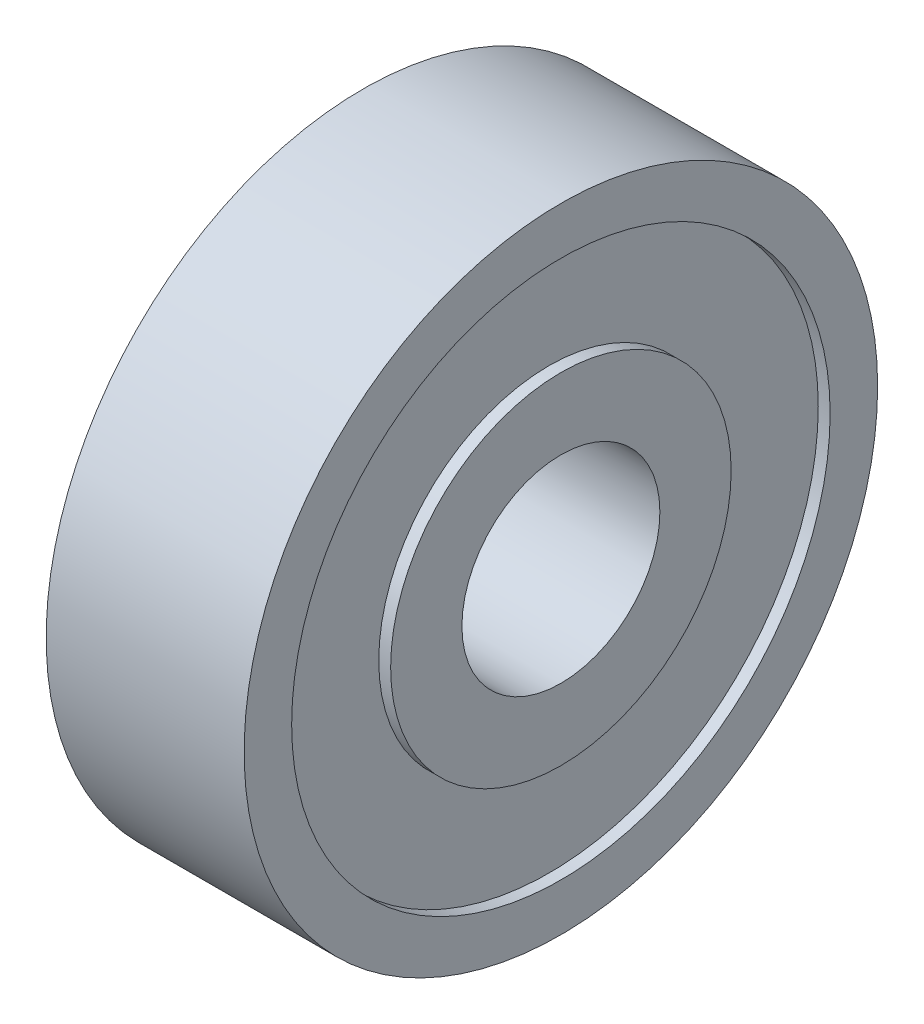
ISO-10303-21;
HEADER;
FILE_DESCRIPTION(('STEP AP214'),'2;1');
FILE_NAME('part.step','',(''),(''),'','','');
FILE_SCHEMA(('AUTOMOTIVE_DESIGN { 1 0 10303 214 1 1 1 1 }'));
ENDSEC;
DATA;
#1=APPLICATION_CONTEXT('core data for automotive mechanical design processes');
#2=APPLICATION_PROTOCOL_DEFINITION('international standard','automotive_design',2000,#1);
#3=PRODUCT_CONTEXT('',#1,'mechanical');
#4=PRODUCT('Part','Part','',(#3));
#5=PRODUCT_RELATED_PRODUCT_CATEGORY('part','',(#4));
#6=PRODUCT_DEFINITION_FORMATION('','',#4);
#7=PRODUCT_DEFINITION_CONTEXT('part definition',#1,'design');
#8=PRODUCT_DEFINITION('design','',#6,#7);
#9=PRODUCT_DEFINITION_SHAPE('','',#8);
#10=(LENGTH_UNIT() NAMED_UNIT(*) SI_UNIT(.MILLI.,.METRE.));
#11=(NAMED_UNIT(*) PLANE_ANGLE_UNIT() SI_UNIT($,.RADIAN.));
#12=(NAMED_UNIT(*) SI_UNIT($,.STERADIAN.) SOLID_ANGLE_UNIT());
#13=UNCERTAINTY_MEASURE_WITH_UNIT(LENGTH_MEASURE(1.E-05),#10,'distance_accuracy_value','');
#14=(GEOMETRIC_REPRESENTATION_CONTEXT(3) GLOBAL_UNCERTAINTY_ASSIGNED_CONTEXT((#13)) GLOBAL_UNIT_ASSIGNED_CONTEXT((#10,
#11,#12)) REPRESENTATION_CONTEXT('',''));
#15=CARTESIAN_POINT('',(0.,0.,0.));
#16=DIRECTION('',(0.,0.,1.));
#17=DIRECTION('',(1.,0.,0.));
#18=AXIS2_PLACEMENT_3D('',#15,#16,#17);
#19=CARTESIAN_POINT('',(-2.5,0.,0.));
#20=DIRECTION('',(1.,0.,0.));
#21=DIRECTION('',(0.,0.,-1.));
#22=AXIS2_PLACEMENT_3D('',#19,#20,#21);
#23=CYLINDRICAL_SURFACE('',#22,4.3);
#24=CARTESIAN_POINT('',(-2.5,0.,0.));
#25=DIRECTION('',(1.,0.,0.));
#26=DIRECTION('',(0.,0.,-1.));
#27=AXIS2_PLACEMENT_3D('',#24,#25,#26);
#28=CIRCLE('',#27,4.3);
#29=CARTESIAN_POINT('',(-2.5,0.,-4.3));
#30=VERTEX_POINT('',#29);
#31=EDGE_CURVE('E10',#30,#30,#28,.T.);
#32=ORIENTED_EDGE('',*,*,#31,.T.);
#33=EDGE_LOOP('',(#32));
#34=FACE_BOUND('',#33,.T.);
#35=CARTESIAN_POINT('',(-2.2,0.,0.));
#36=DIRECTION('',(1.,0.,0.));
#37=DIRECTION('',(0.,0.,-1.));
#38=AXIS2_PLACEMENT_3D('',#35,#36,#37);
#39=CIRCLE('',#38,4.3);
#40=CARTESIAN_POINT('',(-2.2,0.,-4.3));
#41=VERTEX_POINT('',#40);
#42=EDGE_CURVE('E71',#41,#41,#39,.T.);
#43=ORIENTED_EDGE('',*,*,#42,.F.);
#44=EDGE_LOOP('',(#43));
#45=FACE_BOUND('',#44,.T.);
#46=ADVANCED_FACE('F31',(#34,#45),#23,.T.);
#47=CARTESIAN_POINT('',(-2.5,4.3,0.));
#48=DIRECTION('',(-1.,0.,0.));
#49=DIRECTION('',(0.,0.,1.));
#50=AXIS2_PLACEMENT_3D('',#47,#48,#49);
#51=PLANE('',#50);
#52=CARTESIAN_POINT('',(-2.5,0.,0.));
#53=DIRECTION('',(1.,0.,0.));
#54=DIRECTION('',(0.,0.,-1.));
#55=AXIS2_PLACEMENT_3D('',#52,#53,#54);
#56=CIRCLE('',#55,2.5);
#57=CARTESIAN_POINT('',(-2.5,0.,-2.5));
#58=VERTEX_POINT('',#57);
#59=EDGE_CURVE('E37',#58,#58,#56,.T.);
#60=ORIENTED_EDGE('',*,*,#59,.T.);
#61=EDGE_LOOP('',(#60));
#62=FACE_BOUND('',#61,.T.);
#63=ORIENTED_EDGE('',*,*,#31,.F.);
#64=EDGE_LOOP('',(#63));
#65=FACE_BOUND('',#64,.T.);
#66=ADVANCED_FACE('F79',(#62,#65),#51,.T.);
#67=CARTESIAN_POINT('',(-2.5,0.,0.));
#68=DIRECTION('',(1.,0.,0.));
#69=DIRECTION('',(0.,0.,-1.));
#70=AXIS2_PLACEMENT_3D('',#67,#68,#69);
#71=CYLINDRICAL_SURFACE('',#70,2.5);
#72=CARTESIAN_POINT('',(2.5,0.,0.));
#73=DIRECTION('',(1.,0.,0.));
#74=DIRECTION('',(0.,0.,-1.));
#75=AXIS2_PLACEMENT_3D('',#72,#73,#74);
#76=CIRCLE('',#75,2.5);
#77=CARTESIAN_POINT('',(2.5,0.,-2.5));
#78=VERTEX_POINT('',#77);
#79=EDGE_CURVE('E41',#78,#78,#76,.T.);
#80=ORIENTED_EDGE('',*,*,#79,.T.);
#81=EDGE_LOOP('',(#80));
#82=FACE_BOUND('',#81,.T.);
#83=ORIENTED_EDGE('',*,*,#59,.F.);
#84=EDGE_LOOP('',(#83));
#85=FACE_BOUND('',#84,.T.);
#86=ADVANCED_FACE('F83',(#82,#85),#71,.F.);
#87=CARTESIAN_POINT('',(2.5,2.5,0.));
#88=DIRECTION('',(1.,0.,0.));
#89=DIRECTION('',(0.,0.,-1.));
#90=AXIS2_PLACEMENT_3D('',#87,#88,#89);
#91=PLANE('',#90);
#92=CARTESIAN_POINT('',(2.5,0.,0.));
#93=DIRECTION('',(1.,0.,0.));
#94=DIRECTION('',(0.,0.,-1.));
#95=AXIS2_PLACEMENT_3D('',#92,#93,#94);
#96=CIRCLE('',#95,4.3);
#97=CARTESIAN_POINT('',(2.5,0.,-4.3));
#98=VERTEX_POINT('',#97);
#99=EDGE_CURVE('E45',#98,#98,#96,.T.);
#100=ORIENTED_EDGE('',*,*,#99,.T.);
#101=EDGE_LOOP('',(#100));
#102=FACE_BOUND('',#101,.T.);
#103=ORIENTED_EDGE('',*,*,#79,.F.);
#104=EDGE_LOOP('',(#103));
#105=FACE_BOUND('',#104,.T.);
#106=ADVANCED_FACE('F87',(#102,#105),#91,.T.);
#107=CARTESIAN_POINT('',(-2.5,0.,0.));
#108=DIRECTION('',(1.,0.,0.));
#109=DIRECTION('',(0.,0.,-1.));
#110=AXIS2_PLACEMENT_3D('',#107,#108,#109);
#111=CYLINDRICAL_SURFACE('',#110,4.3);
#112=CARTESIAN_POINT('',(2.2,0.,0.));
#113=DIRECTION('',(1.,0.,0.));
#114=DIRECTION('',(0.,0.,-1.));
#115=AXIS2_PLACEMENT_3D('',#112,#113,#114);
#116=CIRCLE('',#115,4.3);
#117=CARTESIAN_POINT('',(2.2,0.,-4.3));
#118=VERTEX_POINT('',#117);
#119=EDGE_CURVE('E50',#118,#118,#116,.T.);
#120=ORIENTED_EDGE('',*,*,#119,.T.);
#121=EDGE_LOOP('',(#120));
#122=FACE_BOUND('',#121,.T.);
#123=ORIENTED_EDGE('',*,*,#99,.F.);
#124=EDGE_LOOP('',(#123));
#125=FACE_BOUND('',#124,.T.);
#126=ADVANCED_FACE('F94',(#122,#125),#111,.T.);
#127=CARTESIAN_POINT('',(2.2,4.3,0.));
#128=DIRECTION('',(1.,0.,0.));
#129=DIRECTION('',(0.,0.,-1.));
#130=AXIS2_PLACEMENT_3D('',#127,#128,#129);
#131=PLANE('',#130);
#132=CARTESIAN_POINT('',(2.2,0.,0.));
#133=DIRECTION('',(1.,0.,0.));
#134=DIRECTION('',(0.,0.,-1.));
#135=AXIS2_PLACEMENT_3D('',#132,#133,#134);
#136=CIRCLE('',#135,6.8);
#137=CARTESIAN_POINT('',(2.2,0.,-6.8));
#138=VERTEX_POINT('',#137);
#139=EDGE_CURVE('E53',#138,#138,#136,.T.);
#140=ORIENTED_EDGE('',*,*,#139,.T.);
#141=EDGE_LOOP('',(#140));
#142=FACE_BOUND('',#141,.T.);
#143=ORIENTED_EDGE('',*,*,#119,.F.);
#144=EDGE_LOOP('',(#143));
#145=FACE_BOUND('',#144,.T.);
#146=ADVANCED_FACE('F98',(#142,#145),#131,.T.);
#147=CARTESIAN_POINT('',(-2.5,0.,0.));
#148=DIRECTION('',(1.,0.,0.));
#149=DIRECTION('',(0.,0.,-1.));
#150=AXIS2_PLACEMENT_3D('',#147,#148,#149);
#151=CYLINDRICAL_SURFACE('',#150,6.8);
#152=CARTESIAN_POINT('',(2.5,0.,0.));
#153=DIRECTION('',(1.,0.,0.));
#154=DIRECTION('',(0.,0.,-1.));
#155=AXIS2_PLACEMENT_3D('',#152,#153,#154);
#156=CIRCLE('',#155,6.8);
#157=CARTESIAN_POINT('',(2.5,0.,-6.8));
#158=VERTEX_POINT('',#157);
#159=EDGE_CURVE('E56',#158,#158,#156,.T.);
#160=ORIENTED_EDGE('',*,*,#159,.T.);
#161=EDGE_LOOP('',(#160));
#162=FACE_BOUND('',#161,.T.);
#163=ORIENTED_EDGE('',*,*,#139,.F.);
#164=EDGE_LOOP('',(#163));
#165=FACE_BOUND('',#164,.T.);
#166=ADVANCED_FACE('F102',(#162,#165),#151,.F.);
#167=CARTESIAN_POINT('',(2.5,6.8,0.));
#168=DIRECTION('',(1.,0.,0.));
#169=DIRECTION('',(0.,0.,-1.));
#170=AXIS2_PLACEMENT_3D('',#167,#168,#169);
#171=PLANE('',#170);
#172=CARTESIAN_POINT('',(2.5,0.,0.));
#173=DIRECTION('',(1.,0.,0.));
#174=DIRECTION('',(0.,0.,-1.));
#175=AXIS2_PLACEMENT_3D('',#172,#173,#174);
#176=CIRCLE('',#175,8.);
#177=CARTESIAN_POINT('',(2.5,0.,-8.));
#178=VERTEX_POINT('',#177);
#179=EDGE_CURVE('E59',#178,#178,#176,.T.);
#180=ORIENTED_EDGE('',*,*,#179,.T.);
#181=EDGE_LOOP('',(#180));
#182=FACE_BOUND('',#181,.T.);
#183=ORIENTED_EDGE('',*,*,#159,.F.);
#184=EDGE_LOOP('',(#183));
#185=FACE_BOUND('',#184,.T.);
#186=ADVANCED_FACE('F106',(#182,#185),#171,.T.);
#187=CARTESIAN_POINT('',(-2.5,0.,0.));
#188=DIRECTION('',(1.,0.,0.));
#189=DIRECTION('',(0.,0.,-1.));
#190=AXIS2_PLACEMENT_3D('',#187,#188,#189);
#191=CYLINDRICAL_SURFACE('',#190,8.);
#192=CARTESIAN_POINT('',(-2.5,0.,0.));
#193=DIRECTION('',(1.,0.,0.));
#194=DIRECTION('',(0.,0.,-1.));
#195=AXIS2_PLACEMENT_3D('',#192,#193,#194);
#196=CIRCLE('',#195,8.);
#197=CARTESIAN_POINT('',(-2.5,0.,-8.));
#198=VERTEX_POINT('',#197);
#199=EDGE_CURVE('E62',#198,#198,#196,.T.);
#200=ORIENTED_EDGE('',*,*,#199,.T.);
#201=EDGE_LOOP('',(#200));
#202=FACE_BOUND('',#201,.T.);
#203=ORIENTED_EDGE('',*,*,#179,.F.);
#204=EDGE_LOOP('',(#203));
#205=FACE_BOUND('',#204,.T.);
#206=ADVANCED_FACE('F110',(#202,#205),#191,.T.);
#207=CARTESIAN_POINT('',(-2.5,8.,0.));
#208=DIRECTION('',(-1.,0.,0.));
#209=DIRECTION('',(0.,0.,1.));
#210=AXIS2_PLACEMENT_3D('',#207,#208,#209);
#211=PLANE('',#210);
#212=CARTESIAN_POINT('',(-2.5,0.,0.));
#213=DIRECTION('',(1.,0.,0.));
#214=DIRECTION('',(0.,0.,-1.));
#215=AXIS2_PLACEMENT_3D('',#212,#213,#214);
#216=CIRCLE('',#215,6.8);
#217=CARTESIAN_POINT('',(-2.5,0.,-6.8));
#218=VERTEX_POINT('',#217);
#219=EDGE_CURVE('E65',#218,#218,#216,.T.);
#220=ORIENTED_EDGE('',*,*,#219,.T.);
#221=EDGE_LOOP('',(#220));
#222=FACE_BOUND('',#221,.T.);
#223=ORIENTED_EDGE('',*,*,#199,.F.);
#224=EDGE_LOOP('',(#223));
#225=FACE_BOUND('',#224,.T.);
#226=ADVANCED_FACE('F114',(#222,#225),#211,.T.);
#227=CARTESIAN_POINT('',(-2.5,0.,0.));
#228=DIRECTION('',(1.,0.,0.));
#229=DIRECTION('',(0.,0.,-1.));
#230=AXIS2_PLACEMENT_3D('',#227,#228,#229);
#231=CYLINDRICAL_SURFACE('',#230,6.8);
#232=CARTESIAN_POINT('',(-2.2,0.,0.));
#233=DIRECTION('',(1.,0.,0.));
#234=DIRECTION('',(0.,0.,-1.));
#235=AXIS2_PLACEMENT_3D('',#232,#233,#234);
#236=CIRCLE('',#235,6.8);
#237=CARTESIAN_POINT('',(-2.2,0.,-6.8));
#238=VERTEX_POINT('',#237);
#239=EDGE_CURVE('E68',#238,#238,#236,.T.);
#240=ORIENTED_EDGE('',*,*,#239,.T.);
#241=EDGE_LOOP('',(#240));
#242=FACE_BOUND('',#241,.T.);
#243=ORIENTED_EDGE('',*,*,#219,.F.);
#244=EDGE_LOOP('',(#243));
#245=FACE_BOUND('',#244,.T.);
#246=ADVANCED_FACE('F118',(#242,#245),#231,.F.);
#247=CARTESIAN_POINT('',(-2.2,6.8,0.));
#248=DIRECTION('',(-1.,0.,0.));
#249=DIRECTION('',(0.,0.,1.));
#250=AXIS2_PLACEMENT_3D('',#247,#248,#249);
#251=PLANE('',#250);
#252=ORIENTED_EDGE('',*,*,#42,.T.);
#253=EDGE_LOOP('',(#252));
#254=FACE_BOUND('',#253,.T.);
#255=ORIENTED_EDGE('',*,*,#239,.F.);
#256=EDGE_LOOP('',(#255));
#257=FACE_BOUND('',#256,.T.);
#258=ADVANCED_FACE('F75',(#254,#257),#251,.T.);
#259=CLOSED_SHELL('',(#46,#66,#86,#106,#126,#146,#166,#186,#206,#226,#246,#258));
#260=MANIFOLD_SOLID_BREP('B2',#259);
#261=ADVANCED_BREP_SHAPE_REPRESENTATION('',(#18,#260),#14);
#262=SHAPE_DEFINITION_REPRESENTATION(#9,#261);
ENDSEC;
END-ISO-10303-21;
